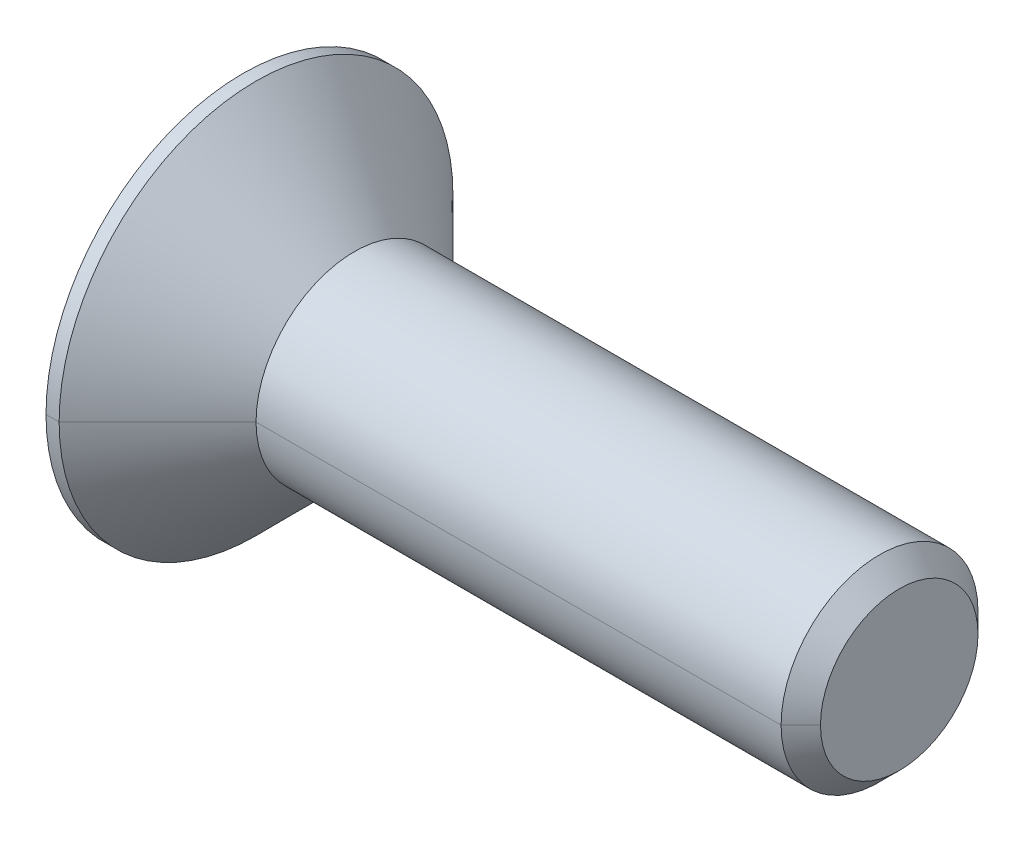
ISO-10303-21;
HEADER;
FILE_DESCRIPTION(('STEP AP214'),'2;1');
FILE_NAME('part.step','',(''),(''),'','','');
FILE_SCHEMA(('AUTOMOTIVE_DESIGN { 1 0 10303 214 1 1 1 1 }'));
ENDSEC;
DATA;
#1=APPLICATION_CONTEXT('core data for automotive mechanical design processes');
#2=APPLICATION_PROTOCOL_DEFINITION('international standard','automotive_design',2000,#1);
#3=PRODUCT_CONTEXT('',#1,'mechanical');
#4=PRODUCT('Part','Part','',(#3));
#5=PRODUCT_RELATED_PRODUCT_CATEGORY('part','',(#4));
#6=PRODUCT_DEFINITION_FORMATION('','',#4);
#7=PRODUCT_DEFINITION_CONTEXT('part definition',#1,'design');
#8=PRODUCT_DEFINITION('design','',#6,#7);
#9=PRODUCT_DEFINITION_SHAPE('','',#8);
#10=(LENGTH_UNIT() NAMED_UNIT(*) SI_UNIT(.MILLI.,.METRE.));
#11=(NAMED_UNIT(*) PLANE_ANGLE_UNIT() SI_UNIT($,.RADIAN.));
#12=(NAMED_UNIT(*) SI_UNIT($,.STERADIAN.) SOLID_ANGLE_UNIT());
#13=UNCERTAINTY_MEASURE_WITH_UNIT(LENGTH_MEASURE(1.E-05),#10,'distance_accuracy_value','');
#14=(GEOMETRIC_REPRESENTATION_CONTEXT(3) GLOBAL_UNCERTAINTY_ASSIGNED_CONTEXT((#13)) GLOBAL_UNIT_ASSIGNED_CONTEXT((#10,
#11,#12)) REPRESENTATION_CONTEXT('',''));
#15=CARTESIAN_POINT('',(0.,0.,0.));
#16=DIRECTION('',(0.,0.,1.));
#17=DIRECTION('',(1.,0.,0.));
#18=AXIS2_PLACEMENT_3D('',#15,#16,#17);
#19=CARTESIAN_POINT('',(1.2,0.,0.));
#20=DIRECTION('',(-1.,0.,0.));
#21=DIRECTION('',(0.,0.,1.));
#22=AXIS2_PLACEMENT_3D('',#19,#20,#21);
#23=PLANE('',#22);
#24=DIRECTION('',(0.,0.,1.));
#25=VECTOR('',#24,1.);
#26=CARTESIAN_POINT('',(1.2,-1.,-0.577350269189626));
#27=LINE('',#26,#25);
#28=CARTESIAN_POINT('',(1.2,-1.,-0.577350269189626));
#29=VERTEX_POINT('',#28);
#30=CARTESIAN_POINT('',(1.2,-1.,0.577350269189626));
#31=VERTEX_POINT('',#30);
#32=EDGE_CURVE('E131',#29,#31,#27,.T.);
#33=ORIENTED_EDGE('',*,*,#32,.T.);
#34=DIRECTION('',(0.,0.866025403784438,0.5));
#35=VECTOR('',#34,1.);
#36=CARTESIAN_POINT('',(1.2,-1.,0.577350269189626));
#37=LINE('',#36,#35);
#38=CARTESIAN_POINT('',(1.2,0.,1.15470053837925));
#39=VERTEX_POINT('',#38);
#40=EDGE_CURVE('E11',#31,#39,#37,.T.);
#41=ORIENTED_EDGE('',*,*,#40,.T.);
#42=DIRECTION('',(0.,0.866025403784438,-0.5));
#43=VECTOR('',#42,1.);
#44=CARTESIAN_POINT('',(1.2,0.,1.15470053837925));
#45=LINE('',#44,#43);
#46=CARTESIAN_POINT('',(1.2,1.,0.577350269189626));
#47=VERTEX_POINT('',#46);
#48=EDGE_CURVE('E47',#39,#47,#45,.T.);
#49=ORIENTED_EDGE('',*,*,#48,.T.);
#50=DIRECTION('',(0.,0.,-1.));
#51=VECTOR('',#50,1.);
#52=CARTESIAN_POINT('',(1.2,1.,0.577350269189626));
#53=LINE('',#52,#51);
#54=CARTESIAN_POINT('',(1.2,1.,-0.577350269189626));
#55=VERTEX_POINT('',#54);
#56=EDGE_CURVE('E104',#47,#55,#53,.T.);
#57=ORIENTED_EDGE('',*,*,#56,.T.);
#58=DIRECTION('',(0.,-0.866025403784439,-0.5));
#59=VECTOR('',#58,1.);
#60=CARTESIAN_POINT('',(1.2,1.,-0.577350269189626));
#61=LINE('',#60,#59);
#62=CARTESIAN_POINT('',(1.2,0.,-1.15470053837925));
#63=VERTEX_POINT('',#62);
#64=EDGE_CURVE('E98',#55,#63,#61,.T.);
#65=ORIENTED_EDGE('',*,*,#64,.T.);
#66=DIRECTION('',(0.,-0.866025403784439,0.5));
#67=VECTOR('',#66,1.);
#68=CARTESIAN_POINT('',(1.2,0.,-1.15470053837925));
#69=LINE('',#68,#67);
#70=EDGE_CURVE('E101',#63,#29,#69,.T.);
#71=ORIENTED_EDGE('',*,*,#70,.T.);
#72=EDGE_LOOP('',(#33,#41,#49,#57,#65,#71));
#73=FACE_BOUND('',#72,.T.);
#74=ADVANCED_FACE('F17',(#73),#23,.T.);
#75=CARTESIAN_POINT('',(1.2,-1.,0.577350269189626));
#76=DIRECTION('',(0.,-0.5,0.866025403784439));
#77=DIRECTION('',(-1.,0.,0.));
#78=AXIS2_PLACEMENT_3D('',#75,#76,#77);
#79=PLANE('',#78);
#80=DIRECTION('',(0.,0.866025403784438,0.5));
#81=VECTOR('',#80,1.);
#82=CARTESIAN_POINT('',(0.,-1.,0.577350269189626));
#83=LINE('',#82,#81);
#84=CARTESIAN_POINT('',(0.,-1.,0.577350269189626));
#85=VERTEX_POINT('',#84);
#86=CARTESIAN_POINT('',(0.,0.,1.15470053837925));
#87=VERTEX_POINT('',#86);
#88=EDGE_CURVE('E162',#85,#87,#83,.T.);
#89=ORIENTED_EDGE('',*,*,#88,.T.);
#90=DIRECTION('',(-1.,0.,0.));
#91=VECTOR('',#90,1.);
#92=CARTESIAN_POINT('',(1.2,0.,1.15470053837925));
#93=LINE('',#92,#91);
#94=EDGE_CURVE('E25',#39,#87,#93,.T.);
#95=ORIENTED_EDGE('',*,*,#94,.F.);
#96=ORIENTED_EDGE('',*,*,#40,.F.);
#97=DIRECTION('',(-1.,0.,0.));
#98=VECTOR('',#97,1.);
#99=CARTESIAN_POINT('',(1.2,-1.,0.577350269189626));
#100=LINE('',#99,#98);
#101=EDGE_CURVE('E135',#31,#85,#100,.T.);
#102=ORIENTED_EDGE('',*,*,#101,.T.);
#103=EDGE_LOOP('',(#89,#95,#96,#102));
#104=FACE_BOUND('',#103,.T.);
#105=ADVANCED_FACE('F168',(#104),#79,.F.);
#106=CARTESIAN_POINT('',(1.2,0.,1.15470053837925));
#107=DIRECTION('',(0.,0.5,0.866025403784439));
#108=DIRECTION('',(1.,0.,0.));
#109=AXIS2_PLACEMENT_3D('',#106,#107,#108);
#110=PLANE('',#109);
#111=DIRECTION('',(0.,0.866025403784438,-0.5));
#112=VECTOR('',#111,1.);
#113=CARTESIAN_POINT('',(0.,0.,1.15470053837925));
#114=LINE('',#113,#112);
#115=CARTESIAN_POINT('',(0.,1.,0.577350269189626));
#116=VERTEX_POINT('',#115);
#117=EDGE_CURVE('E153',#87,#116,#114,.T.);
#118=ORIENTED_EDGE('',*,*,#117,.T.);
#119=DIRECTION('',(-1.,0.,0.));
#120=VECTOR('',#119,1.);
#121=CARTESIAN_POINT('',(1.2,1.,0.577350269189626));
#122=LINE('',#121,#120);
#123=EDGE_CURVE('E142',#47,#116,#122,.T.);
#124=ORIENTED_EDGE('',*,*,#123,.F.);
#125=ORIENTED_EDGE('',*,*,#48,.F.);
#126=ORIENTED_EDGE('',*,*,#94,.T.);
#127=EDGE_LOOP('',(#118,#124,#125,#126));
#128=FACE_BOUND('',#127,.T.);
#129=ADVANCED_FACE('F152',(#128),#110,.F.);
#130=CARTESIAN_POINT('',(1.2,1.,0.577350269189626));
#131=DIRECTION('',(0.,1.,0.));
#132=DIRECTION('',(1.,0.,0.));
#133=AXIS2_PLACEMENT_3D('',#130,#131,#132);
#134=PLANE('',#133);
#135=DIRECTION('',(0.,0.,-1.));
#136=VECTOR('',#135,1.);
#137=CARTESIAN_POINT('',(0.,1.,0.577350269189626));
#138=LINE('',#137,#136);
#139=CARTESIAN_POINT('',(0.,1.,-0.577350269189626));
#140=VERTEX_POINT('',#139);
#141=EDGE_CURVE('E164',#116,#140,#138,.T.);
#142=ORIENTED_EDGE('',*,*,#141,.T.);
#143=DIRECTION('',(-1.,0.,0.));
#144=VECTOR('',#143,1.);
#145=CARTESIAN_POINT('',(1.2,1.,-0.577350269189626));
#146=LINE('',#145,#144);
#147=EDGE_CURVE('E108',#55,#140,#146,.T.);
#148=ORIENTED_EDGE('',*,*,#147,.F.);
#149=ORIENTED_EDGE('',*,*,#56,.F.);
#150=ORIENTED_EDGE('',*,*,#123,.T.);
#151=EDGE_LOOP('',(#142,#148,#149,#150));
#152=FACE_BOUND('',#151,.T.);
#153=ADVANCED_FACE('F313',(#152),#134,.F.);
#154=CARTESIAN_POINT('',(1.2,1.,-0.577350269189626));
#155=DIRECTION('',(0.,0.5,-0.866025403784439));
#156=DIRECTION('',(-1.,0.,0.));
#157=AXIS2_PLACEMENT_3D('',#154,#155,#156);
#158=PLANE('',#157);
#159=DIRECTION('',(0.,-0.866025403784439,-0.5));
#160=VECTOR('',#159,1.);
#161=CARTESIAN_POINT('',(0.,1.,-0.577350269189626));
#162=LINE('',#161,#160);
#163=CARTESIAN_POINT('',(0.,0.,-1.15470053837925));
#164=VERTEX_POINT('',#163);
#165=EDGE_CURVE('E114',#140,#164,#162,.T.);
#166=ORIENTED_EDGE('',*,*,#165,.T.);
#167=DIRECTION('',(-1.,0.,0.));
#168=VECTOR('',#167,1.);
#169=CARTESIAN_POINT('',(1.2,0.,-1.15470053837925));
#170=LINE('',#169,#168);
#171=EDGE_CURVE('E109',#63,#164,#170,.T.);
#172=ORIENTED_EDGE('',*,*,#171,.F.);
#173=ORIENTED_EDGE('',*,*,#64,.F.);
#174=ORIENTED_EDGE('',*,*,#147,.T.);
#175=EDGE_LOOP('',(#166,#172,#173,#174));
#176=FACE_BOUND('',#175,.T.);
#177=ADVANCED_FACE('F112',(#176),#158,.F.);
#178=CARTESIAN_POINT('',(1.2,0.,-1.15470053837925));
#179=DIRECTION('',(0.,-0.5,-0.866025403784439));
#180=DIRECTION('',(0.,-0.866025403784439,0.5));
#181=AXIS2_PLACEMENT_3D('',#178,#179,#180);
#182=PLANE('',#181);
#183=DIRECTION('',(0.,-0.866025403784439,0.5));
#184=VECTOR('',#183,1.);
#185=CARTESIAN_POINT('',(0.,0.,-1.15470053837925));
#186=LINE('',#185,#184);
#187=CARTESIAN_POINT('',(0.,-1.,-0.577350269189626));
#188=VERTEX_POINT('',#187);
#189=EDGE_CURVE('E179',#164,#188,#186,.T.);
#190=ORIENTED_EDGE('',*,*,#189,.T.);
#191=DIRECTION('',(-1.,0.,0.));
#192=VECTOR('',#191,1.);
#193=CARTESIAN_POINT('',(1.2,-1.,-0.577350269189626));
#194=LINE('',#193,#192);
#195=EDGE_CURVE('E122',#29,#188,#194,.T.);
#196=ORIENTED_EDGE('',*,*,#195,.F.);
#197=ORIENTED_EDGE('',*,*,#70,.F.);
#198=ORIENTED_EDGE('',*,*,#171,.T.);
#199=EDGE_LOOP('',(#190,#196,#197,#198));
#200=FACE_BOUND('',#199,.T.);
#201=ADVANCED_FACE('F120',(#200),#182,.F.);
#202=CARTESIAN_POINT('',(1.2,-1.,-0.577350269189626));
#203=DIRECTION('',(0.,-1.,0.));
#204=DIRECTION('',(0.,0.,-1.));
#205=AXIS2_PLACEMENT_3D('',#202,#203,#204);
#206=PLANE('',#205);
#207=DIRECTION('',(0.,0.,1.));
#208=VECTOR('',#207,1.);
#209=CARTESIAN_POINT('',(0.,-1.,-0.577350269189626));
#210=LINE('',#209,#208);
#211=EDGE_CURVE('E172',#188,#85,#210,.T.);
#212=ORIENTED_EDGE('',*,*,#211,.T.);
#213=ORIENTED_EDGE('',*,*,#101,.F.);
#214=ORIENTED_EDGE('',*,*,#32,.F.);
#215=ORIENTED_EDGE('',*,*,#195,.T.);
#216=EDGE_LOOP('',(#212,#213,#214,#215));
#217=FACE_BOUND('',#216,.T.);
#218=ADVANCED_FACE('F288',(#217),#206,.F.);
#219=CARTESIAN_POINT('',(9.7,0.,0.));
#220=DIRECTION('',(-1.,0.,0.));
#221=DIRECTION('',(0.,0.,1.));
#222=AXIS2_PLACEMENT_3D('',#219,#220,#221);
#223=CONICAL_SURFACE('',#222,1.5,0.785398163397451);
#224=DIRECTION('',(-0.707106781186546,0.,-0.70710678118655));
#225=VECTOR('',#224,1.);
#226=CARTESIAN_POINT('',(9.7,0.,-1.5));
#227=LINE('',#226,#225);
#228=CARTESIAN_POINT('',(10.,0.,-1.2));
#229=VERTEX_POINT('',#228);
#230=CARTESIAN_POINT('',(9.7,0.,-1.5));
#231=VERTEX_POINT('',#230);
#232=EDGE_CURVE('E539',#229,#231,#227,.T.);
#233=ORIENTED_EDGE('',*,*,#232,.F.);
#234=CARTESIAN_POINT('',(10.,0.,0.));
#235=DIRECTION('',(1.,0.,0.));
#236=DIRECTION('',(0.,0.,1.));
#237=AXIS2_PLACEMENT_3D('',#234,#235,#236);
#238=CIRCLE('',#237,1.2);
#239=CARTESIAN_POINT('',(10.,0.,1.2));
#240=VERTEX_POINT('',#239);
#241=EDGE_CURVE('E166',#240,#229,#238,.T.);
#242=ORIENTED_EDGE('',*,*,#241,.F.);
#243=DIRECTION('',(-0.707106781186546,0.,0.70710678118655));
#244=VECTOR('',#243,1.);
#245=CARTESIAN_POINT('',(9.7,0.,1.5));
#246=LINE('',#245,#244);
#247=CARTESIAN_POINT('',(9.7,0.,1.5));
#248=VERTEX_POINT('',#247);
#249=EDGE_CURVE('E533',#240,#248,#246,.T.);
#250=ORIENTED_EDGE('',*,*,#249,.T.);
#251=CARTESIAN_POINT('',(9.7,0.,0.));
#252=DIRECTION('',(-1.,0.,0.));
#253=DIRECTION('',(0.,0.,1.));
#254=AXIS2_PLACEMENT_3D('',#251,#252,#253);
#255=CIRCLE('',#254,1.5);
#256=EDGE_CURVE('E196',#231,#248,#255,.T.);
#257=ORIENTED_EDGE('',*,*,#256,.F.);
#258=EDGE_LOOP('',(#233,#242,#250,#257));
#259=FACE_BOUND('',#258,.T.);
#260=ADVANCED_FACE('F292',(#259),#223,.T.);
#261=CARTESIAN_POINT('',(0.,0.,0.));
#262=DIRECTION('',(-1.,0.,0.));
#263=DIRECTION('',(0.,0.,1.));
#264=AXIS2_PLACEMENT_3D('',#261,#262,#263);
#265=CYLINDRICAL_SURFACE('',#264,3.);
#266=DIRECTION('',(-1.,0.,0.));
#267=VECTOR('',#266,1.);
#268=CARTESIAN_POINT('',(0.,0.,-3.));
#269=LINE('',#268,#267);
#270=CARTESIAN_POINT('',(0.199999999999978,0.,-3.));
#271=VERTEX_POINT('',#270);
#272=CARTESIAN_POINT('',(0.,0.,-3.));
#273=VERTEX_POINT('',#272);
#274=EDGE_CURVE('E557',#271,#273,#269,.T.);
#275=ORIENTED_EDGE('',*,*,#274,.F.);
#276=CARTESIAN_POINT('',(0.199999999999978,0.,0.));
#277=DIRECTION('',(-1.,0.,0.));
#278=DIRECTION('',(0.,0.,1.));
#279=AXIS2_PLACEMENT_3D('',#276,#277,#278);
#280=CIRCLE('',#279,3.);
#281=CARTESIAN_POINT('',(0.199999999999978,0.,3.));
#282=VERTEX_POINT('',#281);
#283=EDGE_CURVE('E203',#271,#282,#280,.T.);
#284=ORIENTED_EDGE('',*,*,#283,.T.);
#285=DIRECTION('',(-1.,0.,0.));
#286=VECTOR('',#285,1.);
#287=CARTESIAN_POINT('',(0.,0.,3.));
#288=LINE('',#287,#286);
#289=CARTESIAN_POINT('',(0.,0.,3.));
#290=VERTEX_POINT('',#289);
#291=EDGE_CURVE('E560',#282,#290,#288,.T.);
#292=ORIENTED_EDGE('',*,*,#291,.T.);
#293=CARTESIAN_POINT('',(0.,0.,0.));
#294=DIRECTION('',(-1.,0.,0.));
#295=DIRECTION('',(0.,0.,1.));
#296=AXIS2_PLACEMENT_3D('',#293,#294,#295);
#297=CIRCLE('',#296,3.);
#298=EDGE_CURVE('E173',#273,#290,#297,.T.);
#299=ORIENTED_EDGE('',*,*,#298,.F.);
#300=EDGE_LOOP('',(#275,#284,#292,#299));
#301=FACE_BOUND('',#300,.T.);
#302=ADVANCED_FACE('F333',(#301),#265,.T.);
#303=CARTESIAN_POINT('',(1.7,0.,0.));
#304=DIRECTION('',(-1.,0.,0.));
#305=DIRECTION('',(0.,0.,1.));
#306=AXIS2_PLACEMENT_3D('',#303,#304,#305);
#307=CONICAL_SURFACE('',#306,1.5,0.785398163397442);
#308=DIRECTION('',(-0.707106781186552,0.,-0.707106781186544));
#309=VECTOR('',#308,1.);
#310=CARTESIAN_POINT('',(1.7,0.,-1.5));
#311=LINE('',#310,#309);
#312=CARTESIAN_POINT('',(1.7,0.,-1.5));
#313=VERTEX_POINT('',#312);
#314=EDGE_CURVE('E186',#313,#271,#311,.T.);
#315=ORIENTED_EDGE('',*,*,#314,.F.);
#316=CARTESIAN_POINT('',(1.7,0.,0.));
#317=DIRECTION('',(-1.,0.,0.));
#318=DIRECTION('',(0.,0.,1.));
#319=AXIS2_PLACEMENT_3D('',#316,#317,#318);
#320=CIRCLE('',#319,1.5);
#321=CARTESIAN_POINT('',(1.7,0.,1.5));
#322=VERTEX_POINT('',#321);
#323=EDGE_CURVE('E200',#313,#322,#320,.T.);
#324=ORIENTED_EDGE('',*,*,#323,.T.);
#325=DIRECTION('',(-0.707106781186552,0.,0.707106781186544));
#326=VECTOR('',#325,1.);
#327=CARTESIAN_POINT('',(1.7,0.,1.5));
#328=LINE('',#327,#326);
#329=EDGE_CURVE('E551',#322,#282,#328,.T.);
#330=ORIENTED_EDGE('',*,*,#329,.T.);
#331=ORIENTED_EDGE('',*,*,#283,.F.);
#332=EDGE_LOOP('',(#315,#324,#330,#331));
#333=FACE_BOUND('',#332,.T.);
#334=ADVANCED_FACE('F273',(#333),#307,.T.);
#335=CARTESIAN_POINT('',(0.,0.,0.));
#336=DIRECTION('',(-1.,0.,0.));
#337=DIRECTION('',(0.,0.,1.));
#338=AXIS2_PLACEMENT_3D('',#335,#336,#337);
#339=CYLINDRICAL_SURFACE('',#338,1.5);
#340=DIRECTION('',(-1.,0.,0.));
#341=VECTOR('',#340,1.);
#342=CARTESIAN_POINT('',(0.,0.,-1.5));
#343=LINE('',#342,#341);
#344=EDGE_CURVE('E520',#231,#313,#343,.T.);
#345=ORIENTED_EDGE('',*,*,#344,.F.);
#346=ORIENTED_EDGE('',*,*,#256,.T.);
#347=DIRECTION('',(-1.,0.,0.));
#348=VECTOR('',#347,1.);
#349=CARTESIAN_POINT('',(0.,0.,1.5));
#350=LINE('',#349,#348);
#351=EDGE_CURVE('E183',#248,#322,#350,.T.);
#352=ORIENTED_EDGE('',*,*,#351,.T.);
#353=ORIENTED_EDGE('',*,*,#323,.F.);
#354=EDGE_LOOP('',(#345,#346,#352,#353));
#355=FACE_BOUND('',#354,.T.);
#356=ADVANCED_FACE('F268',(#355),#339,.T.);
#357=CARTESIAN_POINT('',(10.,0.,0.));
#358=DIRECTION('',(-1.,0.,0.));
#359=DIRECTION('',(0.,0.,1.));
#360=AXIS2_PLACEMENT_3D('',#357,#358,#359);
#361=PLANE('',#360);
#362=ORIENTED_EDGE('',*,*,#241,.T.);
#363=CARTESIAN_POINT('',(10.,0.,0.));
#364=DIRECTION('',(1.,0.,0.));
#365=DIRECTION('',(0.,0.,1.));
#366=AXIS2_PLACEMENT_3D('',#363,#364,#365);
#367=CIRCLE('',#366,1.2);
#368=EDGE_CURVE('E546',#229,#240,#367,.T.);
#369=ORIENTED_EDGE('',*,*,#368,.T.);
#370=EDGE_LOOP('',(#362,#369));
#371=FACE_BOUND('',#370,.T.);
#372=ADVANCED_FACE('F272',(#371),#361,.F.);
#373=CARTESIAN_POINT('',(0.,3.,0.));
#374=DIRECTION('',(1.,0.,0.));
#375=DIRECTION('',(0.,1.,0.));
#376=AXIS2_PLACEMENT_3D('',#373,#374,#375);
#377=PLANE('',#376);
#378=ORIENTED_EDGE('',*,*,#88,.F.);
#379=ORIENTED_EDGE('',*,*,#211,.F.);
#380=ORIENTED_EDGE('',*,*,#189,.F.);
#381=ORIENTED_EDGE('',*,*,#165,.F.);
#382=ORIENTED_EDGE('',*,*,#141,.F.);
#383=ORIENTED_EDGE('',*,*,#117,.F.);
#384=EDGE_LOOP('',(#378,#379,#380,#381,#382,#383));
#385=FACE_BOUND('',#384,.T.);
#386=CARTESIAN_POINT('',(0.,0.,0.));
#387=DIRECTION('',(-1.,0.,0.));
#388=DIRECTION('',(0.,0.,1.));
#389=AXIS2_PLACEMENT_3D('',#386,#387,#388);
#390=CIRCLE('',#389,3.);
#391=EDGE_CURVE('E564',#290,#273,#390,.T.);
#392=ORIENTED_EDGE('',*,*,#391,.T.);
#393=ORIENTED_EDGE('',*,*,#298,.T.);
#394=EDGE_LOOP('',(#392,#393));
#395=FACE_BOUND('',#394,.T.);
#396=ADVANCED_FACE('F159',(#385,#395),#377,.F.);
#397=CARTESIAN_POINT('',(0.,0.,0.));
#398=DIRECTION('',(-1.,0.,0.));
#399=DIRECTION('',(0.,0.,1.));
#400=AXIS2_PLACEMENT_3D('',#397,#398,#399);
#401=CYLINDRICAL_SURFACE('',#400,1.5);
#402=CARTESIAN_POINT('',(9.7,0.,0.));
#403=DIRECTION('',(-1.,0.,0.));
#404=DIRECTION('',(0.,0.,1.));
#405=AXIS2_PLACEMENT_3D('',#402,#403,#404);
#406=CIRCLE('',#405,1.5);
#407=EDGE_CURVE('E526',#248,#231,#406,.T.);
#408=ORIENTED_EDGE('',*,*,#407,.T.);
#409=ORIENTED_EDGE('',*,*,#344,.T.);
#410=CARTESIAN_POINT('',(1.7,0.,0.));
#411=DIRECTION('',(-1.,0.,0.));
#412=DIRECTION('',(0.,0.,1.));
#413=AXIS2_PLACEMENT_3D('',#410,#411,#412);
#414=CIRCLE('',#413,1.5);
#415=EDGE_CURVE('E529',#322,#313,#414,.T.);
#416=ORIENTED_EDGE('',*,*,#415,.F.);
#417=ORIENTED_EDGE('',*,*,#351,.F.);
#418=EDGE_LOOP('',(#408,#409,#416,#417));
#419=FACE_BOUND('',#418,.T.);
#420=ADVANCED_FACE('F282',(#419),#401,.T.);
#421=CARTESIAN_POINT('',(1.7,0.,0.));
#422=DIRECTION('',(-1.,0.,0.));
#423=DIRECTION('',(0.,0.,1.));
#424=AXIS2_PLACEMENT_3D('',#421,#422,#423);
#425=CONICAL_SURFACE('',#424,1.5,0.785398163397442);
#426=ORIENTED_EDGE('',*,*,#415,.T.);
#427=ORIENTED_EDGE('',*,*,#314,.T.);
#428=CARTESIAN_POINT('',(0.199999999999978,0.,0.));
#429=DIRECTION('',(-1.,0.,0.));
#430=DIRECTION('',(0.,0.,1.));
#431=AXIS2_PLACEMENT_3D('',#428,#429,#430);
#432=CIRCLE('',#431,3.);
#433=EDGE_CURVE('E537',#282,#271,#432,.T.);
#434=ORIENTED_EDGE('',*,*,#433,.F.);
#435=ORIENTED_EDGE('',*,*,#329,.F.);
#436=EDGE_LOOP('',(#426,#427,#434,#435));
#437=FACE_BOUND('',#436,.T.);
#438=ADVANCED_FACE('F262',(#437),#425,.T.);
#439=CARTESIAN_POINT('',(0.,0.,0.));
#440=DIRECTION('',(-1.,0.,0.));
#441=DIRECTION('',(0.,0.,1.));
#442=AXIS2_PLACEMENT_3D('',#439,#440,#441);
#443=CYLINDRICAL_SURFACE('',#442,3.);
#444=ORIENTED_EDGE('',*,*,#433,.T.);
#445=ORIENTED_EDGE('',*,*,#274,.T.);
#446=ORIENTED_EDGE('',*,*,#391,.F.);
#447=ORIENTED_EDGE('',*,*,#291,.F.);
#448=EDGE_LOOP('',(#444,#445,#446,#447));
#449=FACE_BOUND('',#448,.T.);
#450=ADVANCED_FACE('F253',(#449),#443,.T.);
#451=CARTESIAN_POINT('',(9.7,0.,0.));
#452=DIRECTION('',(-1.,0.,0.));
#453=DIRECTION('',(0.,0.,1.));
#454=AXIS2_PLACEMENT_3D('',#451,#452,#453);
#455=CONICAL_SURFACE('',#454,1.5,0.785398163397451);
#456=ORIENTED_EDGE('',*,*,#368,.F.);
#457=ORIENTED_EDGE('',*,*,#232,.T.);
#458=ORIENTED_EDGE('',*,*,#407,.F.);
#459=ORIENTED_EDGE('',*,*,#249,.F.);
#460=EDGE_LOOP('',(#456,#457,#458,#459));
#461=FACE_BOUND('',#460,.T.);
#462=ADVANCED_FACE('F249',(#461),#455,.T.);
#463=CLOSED_SHELL('',(#74,#105,#129,#153,#177,#201,#218,#260,#302,#334,#356,#372,#396,#420,#438,
#450,#462));
#464=MANIFOLD_SOLID_BREP('B1',#463);
#465=ADVANCED_BREP_SHAPE_REPRESENTATION('',(#18,#464),#14);
#466=SHAPE_DEFINITION_REPRESENTATION(#9,#465);
ENDSEC;
END-ISO-10303-21;
